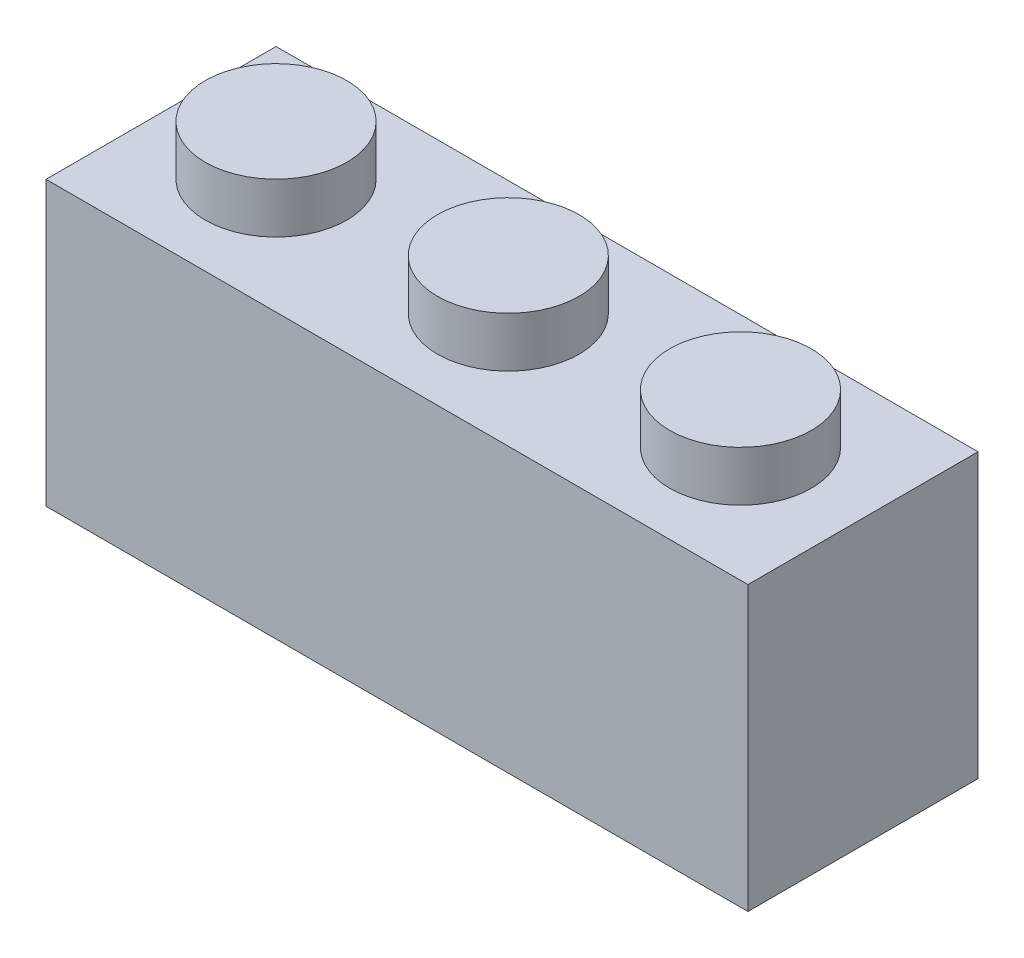
ISO-10303-21;
HEADER;
FILE_DESCRIPTION(('STEP AP214'),'2;1');
FILE_NAME('part.step','',(''),(''),'','','');
FILE_SCHEMA(('AUTOMOTIVE_DESIGN { 1 0 10303 214 1 1 1 1 }'));
ENDSEC;
DATA;
#1=APPLICATION_CONTEXT('core data for automotive mechanical design processes');
#2=APPLICATION_PROTOCOL_DEFINITION('international standard','automotive_design',2000,#1);
#3=PRODUCT_CONTEXT('',#1,'mechanical');
#4=PRODUCT('Part','Part','',(#3));
#5=PRODUCT_RELATED_PRODUCT_CATEGORY('part','',(#4));
#6=PRODUCT_DEFINITION_FORMATION('','',#4);
#7=PRODUCT_DEFINITION_CONTEXT('part definition',#1,'design');
#8=PRODUCT_DEFINITION('design','',#6,#7);
#9=PRODUCT_DEFINITION_SHAPE('','',#8);
#10=(LENGTH_UNIT() NAMED_UNIT(*) SI_UNIT(.MILLI.,.METRE.));
#11=(NAMED_UNIT(*) PLANE_ANGLE_UNIT() SI_UNIT($,.RADIAN.));
#12=(NAMED_UNIT(*) SI_UNIT($,.STERADIAN.) SOLID_ANGLE_UNIT());
#13=UNCERTAINTY_MEASURE_WITH_UNIT(LENGTH_MEASURE(1.E-05),#10,'distance_accuracy_value','');
#14=(GEOMETRIC_REPRESENTATION_CONTEXT(3) GLOBAL_UNCERTAINTY_ASSIGNED_CONTEXT((#13)) GLOBAL_UNIT_ASSIGNED_CONTEXT((#10,
#11,#12)) REPRESENTATION_CONTEXT('',''));
#15=CARTESIAN_POINT('',(0.,0.,0.));
#16=DIRECTION('',(0.,0.,1.));
#17=DIRECTION('',(1.,0.,0.));
#18=AXIS2_PLACEMENT_3D('',#15,#16,#17);
#19=CARTESIAN_POINT('',(-11.9,9.6,3.89999999999999));
#20=DIRECTION('',(1.,0.,0.));
#21=DIRECTION('',(0.,0.,-1.));
#22=AXIS2_PLACEMENT_3D('',#19,#20,#21);
#23=PLANE('',#22);
#24=DIRECTION('',(0.,0.,1.));
#25=VECTOR('',#24,1.);
#26=CARTESIAN_POINT('',(-11.9,0.,3.89999999999999));
#27=LINE('',#26,#25);
#28=CARTESIAN_POINT('',(-11.9,0.,-3.9));
#29=VERTEX_POINT('',#28);
#30=CARTESIAN_POINT('',(-11.9,0.,3.89999999999999));
#31=VERTEX_POINT('',#30);
#32=EDGE_CURVE('E96',#29,#31,#27,.T.);
#33=ORIENTED_EDGE('',*,*,#32,.T.);
#34=DIRECTION('',(0.,-1.,0.));
#35=VECTOR('',#34,1.);
#36=CARTESIAN_POINT('',(-11.9,9.6,3.89999999999999));
#37=LINE('',#36,#35);
#38=CARTESIAN_POINT('',(-11.9,9.6,3.89999999999999));
#39=VERTEX_POINT('',#38);
#40=EDGE_CURVE('E11',#39,#31,#37,.T.);
#41=ORIENTED_EDGE('',*,*,#40,.F.);
#42=DIRECTION('',(0.,0.,1.));
#43=VECTOR('',#42,1.);
#44=CARTESIAN_POINT('',(-11.9,9.6,3.89999999999999));
#45=LINE('',#44,#43);
#46=CARTESIAN_POINT('',(-11.9,9.6,-3.9));
#47=VERTEX_POINT('',#46);
#48=EDGE_CURVE('E84',#47,#39,#45,.T.);
#49=ORIENTED_EDGE('',*,*,#48,.F.);
#50=DIRECTION('',(0.,-1.,0.));
#51=VECTOR('',#50,1.);
#52=CARTESIAN_POINT('',(-11.9,9.6,-3.9));
#53=LINE('',#52,#51);
#54=EDGE_CURVE('E92',#47,#29,#53,.T.);
#55=ORIENTED_EDGE('',*,*,#54,.T.);
#56=EDGE_LOOP('',(#33,#41,#49,#55));
#57=FACE_BOUND('',#56,.T.);
#58=ADVANCED_FACE('F33',(#57),#23,.F.);
#59=CARTESIAN_POINT('',(11.9,9.6,3.9));
#60=DIRECTION('',(0.,0.,-1.));
#61=DIRECTION('',(-1.,0.,0.));
#62=AXIS2_PLACEMENT_3D('',#59,#60,#61);
#63=PLANE('',#62);
#64=DIRECTION('',(1.,0.,0.));
#65=VECTOR('',#64,1.);
#66=CARTESIAN_POINT('',(11.9,0.,3.9));
#67=LINE('',#66,#65);
#68=CARTESIAN_POINT('',(11.9,0.,3.9));
#69=VERTEX_POINT('',#68);
#70=EDGE_CURVE('E88',#31,#69,#67,.T.);
#71=ORIENTED_EDGE('',*,*,#70,.T.);
#72=DIRECTION('',(0.,-1.,0.));
#73=VECTOR('',#72,1.);
#74=CARTESIAN_POINT('',(11.9,9.6,3.9));
#75=LINE('',#74,#73);
#76=CARTESIAN_POINT('',(11.9,9.6,3.9));
#77=VERTEX_POINT('',#76);
#78=EDGE_CURVE('E41',#77,#69,#75,.T.);
#79=ORIENTED_EDGE('',*,*,#78,.F.);
#80=DIRECTION('',(1.,0.,0.));
#81=VECTOR('',#80,1.);
#82=CARTESIAN_POINT('',(11.9,9.6,3.9));
#83=LINE('',#82,#81);
#84=EDGE_CURVE('E79',#39,#77,#83,.T.);
#85=ORIENTED_EDGE('',*,*,#84,.F.);
#86=ORIENTED_EDGE('',*,*,#40,.T.);
#87=EDGE_LOOP('',(#71,#79,#85,#86));
#88=FACE_BOUND('',#87,.T.);
#89=ADVANCED_FACE('F87',(#88),#63,.F.);
#90=CARTESIAN_POINT('',(11.9,9.6,3.9));
#91=DIRECTION('',(-1.,0.,0.));
#92=DIRECTION('',(0.,0.,1.));
#93=AXIS2_PLACEMENT_3D('',#90,#91,#92);
#94=PLANE('',#93);
#95=DIRECTION('',(0.,0.,-1.));
#96=VECTOR('',#95,1.);
#97=CARTESIAN_POINT('',(11.9,0.,3.9));
#98=LINE('',#97,#96);
#99=CARTESIAN_POINT('',(11.9,0.,-3.9));
#100=VERTEX_POINT('',#99);
#101=EDGE_CURVE('E66',#69,#100,#98,.T.);
#102=ORIENTED_EDGE('',*,*,#101,.T.);
#103=DIRECTION('',(0.,-1.,0.));
#104=VECTOR('',#103,1.);
#105=CARTESIAN_POINT('',(11.9,9.6,-3.9));
#106=LINE('',#105,#104);
#107=CARTESIAN_POINT('',(11.9,9.6,-3.9));
#108=VERTEX_POINT('',#107);
#109=EDGE_CURVE('E89',#108,#100,#106,.T.);
#110=ORIENTED_EDGE('',*,*,#109,.F.);
#111=DIRECTION('',(0.,0.,-1.));
#112=VECTOR('',#111,1.);
#113=CARTESIAN_POINT('',(11.9,9.6,3.9));
#114=LINE('',#113,#112);
#115=EDGE_CURVE('E82',#77,#108,#114,.T.);
#116=ORIENTED_EDGE('',*,*,#115,.F.);
#117=ORIENTED_EDGE('',*,*,#78,.T.);
#118=EDGE_LOOP('',(#102,#110,#116,#117));
#119=FACE_BOUND('',#118,.T.);
#120=ADVANCED_FACE('F90',(#119),#94,.F.);
#121=CARTESIAN_POINT('',(11.9,9.6,-3.9));
#122=DIRECTION('',(0.,0.,1.));
#123=DIRECTION('',(1.,0.,0.));
#124=AXIS2_PLACEMENT_3D('',#121,#122,#123);
#125=PLANE('',#124);
#126=DIRECTION('',(-1.,0.,0.));
#127=VECTOR('',#126,1.);
#128=CARTESIAN_POINT('',(11.9,0.,-3.9));
#129=LINE('',#128,#127);
#130=EDGE_CURVE('E72',#100,#29,#129,.T.);
#131=ORIENTED_EDGE('',*,*,#130,.T.);
#132=ORIENTED_EDGE('',*,*,#54,.F.);
#133=DIRECTION('',(-1.,0.,0.));
#134=VECTOR('',#133,1.);
#135=CARTESIAN_POINT('',(11.9,9.6,-3.9));
#136=LINE('',#135,#134);
#137=EDGE_CURVE('E49',#108,#47,#136,.T.);
#138=ORIENTED_EDGE('',*,*,#137,.F.);
#139=ORIENTED_EDGE('',*,*,#109,.T.);
#140=EDGE_LOOP('',(#131,#132,#138,#139));
#141=FACE_BOUND('',#140,.T.);
#142=ADVANCED_FACE('F104',(#141),#125,.F.);
#143=CARTESIAN_POINT('',(0.,9.6,0.));
#144=DIRECTION('',(0.,1.,0.));
#145=DIRECTION('',(0.,0.,1.));
#146=AXIS2_PLACEMENT_3D('',#143,#144,#145);
#147=PLANE('',#146);
#148=CARTESIAN_POINT('',(7.74800000000003,9.6,0.));
#149=DIRECTION('',(0.,1.,0.));
#150=DIRECTION('',(0.,0.,1.));
#151=AXIS2_PLACEMENT_3D('',#148,#149,#150);
#152=CIRCLE('',#151,2.4);
#153=CARTESIAN_POINT('',(7.74800000000003,9.6,2.4));
#154=VERTEX_POINT('',#153);
#155=EDGE_CURVE('E122',#154,#154,#152,.T.);
#156=ORIENTED_EDGE('',*,*,#155,.F.);
#157=EDGE_LOOP('',(#156));
#158=FACE_BOUND('',#157,.T.);
#159=CARTESIAN_POINT('',(-0.125999999999973,9.6,0.));
#160=DIRECTION('',(0.,1.,0.));
#161=DIRECTION('',(0.,0.,1.));
#162=AXIS2_PLACEMENT_3D('',#159,#160,#161);
#163=CIRCLE('',#162,2.4);
#164=CARTESIAN_POINT('',(-0.125999999999973,9.6,2.4));
#165=VERTEX_POINT('',#164);
#166=EDGE_CURVE('E116',#165,#165,#163,.T.);
#167=ORIENTED_EDGE('',*,*,#166,.F.);
#168=EDGE_LOOP('',(#167));
#169=FACE_BOUND('',#168,.T.);
#170=CARTESIAN_POINT('',(-7.99999999999997,9.6,0.));
#171=DIRECTION('',(0.,1.,0.));
#172=DIRECTION('',(0.,0.,1.));
#173=AXIS2_PLACEMENT_3D('',#170,#171,#172);
#174=CIRCLE('',#173,2.4);
#175=CARTESIAN_POINT('',(-7.99999999999997,9.6,2.4));
#176=VERTEX_POINT('',#175);
#177=EDGE_CURVE('E110',#176,#176,#174,.T.);
#178=ORIENTED_EDGE('',*,*,#177,.F.);
#179=EDGE_LOOP('',(#178));
#180=FACE_BOUND('',#179,.T.);
#181=ORIENTED_EDGE('',*,*,#48,.T.);
#182=ORIENTED_EDGE('',*,*,#84,.T.);
#183=ORIENTED_EDGE('',*,*,#115,.T.);
#184=ORIENTED_EDGE('',*,*,#137,.T.);
#185=EDGE_LOOP('',(#181,#182,#183,#184));
#186=FACE_BOUND('',#185,.T.);
#187=ADVANCED_FACE('F80',(#158,#169,#180,#186),#147,.T.);
#188=CARTESIAN_POINT('',(0.,0.,0.));
#189=DIRECTION('',(0.,1.,0.));
#190=DIRECTION('',(0.,0.,1.));
#191=AXIS2_PLACEMENT_3D('',#188,#189,#190);
#192=PLANE('',#191);
#193=CARTESIAN_POINT('',(-7.99999999999997,0.,0.));
#194=DIRECTION('',(0.,-1.,0.));
#195=DIRECTION('',(0.,0.,-1.));
#196=AXIS2_PLACEMENT_3D('',#193,#194,#195);
#197=CIRCLE('',#196,2.5);
#198=CARTESIAN_POINT('',(-7.99999999999997,0.,-2.5));
#199=VERTEX_POINT('',#198);
#200=EDGE_CURVE('E140',#199,#199,#197,.T.);
#201=ORIENTED_EDGE('',*,*,#200,.F.);
#202=EDGE_LOOP('',(#201));
#203=FACE_BOUND('',#202,.T.);
#204=CARTESIAN_POINT('',(-0.125999999999975,0.,0.));
#205=DIRECTION('',(0.,-1.,0.));
#206=DIRECTION('',(0.,0.,-1.));
#207=AXIS2_PLACEMENT_3D('',#204,#205,#206);
#208=CIRCLE('',#207,2.5);
#209=CARTESIAN_POINT('',(-0.125999999999975,0.,-2.5));
#210=VERTEX_POINT('',#209);
#211=EDGE_CURVE('E134',#210,#210,#208,.T.);
#212=ORIENTED_EDGE('',*,*,#211,.F.);
#213=EDGE_LOOP('',(#212));
#214=FACE_BOUND('',#213,.T.);
#215=CARTESIAN_POINT('',(7.74800000000002,0.,0.));
#216=DIRECTION('',(0.,-1.,0.));
#217=DIRECTION('',(0.,0.,-1.));
#218=AXIS2_PLACEMENT_3D('',#215,#216,#217);
#219=CIRCLE('',#218,2.5);
#220=CARTESIAN_POINT('',(7.74800000000002,0.,-2.5));
#221=VERTEX_POINT('',#220);
#222=EDGE_CURVE('E128',#221,#221,#219,.T.);
#223=ORIENTED_EDGE('',*,*,#222,.F.);
#224=EDGE_LOOP('',(#223));
#225=FACE_BOUND('',#224,.T.);
#226=ORIENTED_EDGE('',*,*,#32,.F.);
#227=ORIENTED_EDGE('',*,*,#130,.F.);
#228=ORIENTED_EDGE('',*,*,#101,.F.);
#229=ORIENTED_EDGE('',*,*,#70,.F.);
#230=EDGE_LOOP('',(#226,#227,#228,#229));
#231=FACE_BOUND('',#230,.T.);
#232=ADVANCED_FACE('F107',(#203,#214,#225,#231),#192,.F.);
#233=CARTESIAN_POINT('',(-7.99999999999997,11.3,0.));
#234=DIRECTION('',(0.,-1.,0.));
#235=DIRECTION('',(0.,0.,-1.));
#236=AXIS2_PLACEMENT_3D('',#233,#234,#235);
#237=CYLINDRICAL_SURFACE('',#236,2.4);
#238=CARTESIAN_POINT('',(-7.99999999999997,11.3,0.));
#239=DIRECTION('',(0.,1.,0.));
#240=DIRECTION('',(0.,0.,1.));
#241=AXIS2_PLACEMENT_3D('',#238,#239,#240);
#242=CIRCLE('',#241,2.4);
#243=CARTESIAN_POINT('',(-7.99999999999997,11.3,2.4));
#244=VERTEX_POINT('',#243);
#245=EDGE_CURVE('E99',#244,#244,#242,.T.);
#246=ORIENTED_EDGE('',*,*,#245,.F.);
#247=EDGE_LOOP('',(#246));
#248=FACE_BOUND('',#247,.T.);
#249=ORIENTED_EDGE('',*,*,#177,.T.);
#250=EDGE_LOOP('',(#249));
#251=FACE_BOUND('',#250,.T.);
#252=ADVANCED_FACE('F157',(#248,#251),#237,.T.);
#253=CARTESIAN_POINT('',(-7.99999999999997,11.3,0.));
#254=DIRECTION('',(0.,1.,0.));
#255=DIRECTION('',(0.,0.,1.));
#256=AXIS2_PLACEMENT_3D('',#253,#254,#255);
#257=PLANE('',#256);
#258=ORIENTED_EDGE('',*,*,#245,.T.);
#259=EDGE_LOOP('',(#258));
#260=FACE_BOUND('',#259,.T.);
#261=ADVANCED_FACE('F196',(#260),#257,.T.);
#262=CARTESIAN_POINT('',(-0.125999999999973,11.3,0.));
#263=DIRECTION('',(0.,-1.,0.));
#264=DIRECTION('',(0.,0.,-1.));
#265=AXIS2_PLACEMENT_3D('',#262,#263,#264);
#266=CYLINDRICAL_SURFACE('',#265,2.4);
#267=CARTESIAN_POINT('',(-0.125999999999973,11.3,0.));
#268=DIRECTION('',(0.,1.,0.));
#269=DIRECTION('',(0.,0.,1.));
#270=AXIS2_PLACEMENT_3D('',#267,#268,#269);
#271=CIRCLE('',#270,2.4);
#272=CARTESIAN_POINT('',(-0.125999999999973,11.3,2.4));
#273=VERTEX_POINT('',#272);
#274=EDGE_CURVE('E113',#273,#273,#271,.T.);
#275=ORIENTED_EDGE('',*,*,#274,.F.);
#276=EDGE_LOOP('',(#275));
#277=FACE_BOUND('',#276,.T.);
#278=ORIENTED_EDGE('',*,*,#166,.T.);
#279=EDGE_LOOP('',(#278));
#280=FACE_BOUND('',#279,.T.);
#281=ADVANCED_FACE('F200',(#277,#280),#266,.T.);
#282=CARTESIAN_POINT('',(-0.125999999999973,11.3,0.));
#283=DIRECTION('',(0.,1.,0.));
#284=DIRECTION('',(0.,0.,1.));
#285=AXIS2_PLACEMENT_3D('',#282,#283,#284);
#286=PLANE('',#285);
#287=ORIENTED_EDGE('',*,*,#274,.T.);
#288=EDGE_LOOP('',(#287));
#289=FACE_BOUND('',#288,.T.);
#290=ADVANCED_FACE('F204',(#289),#286,.T.);
#291=CARTESIAN_POINT('',(7.74800000000003,11.3,0.));
#292=DIRECTION('',(0.,-1.,0.));
#293=DIRECTION('',(0.,0.,-1.));
#294=AXIS2_PLACEMENT_3D('',#291,#292,#293);
#295=CYLINDRICAL_SURFACE('',#294,2.4);
#296=CARTESIAN_POINT('',(7.74800000000003,11.3,0.));
#297=DIRECTION('',(0.,1.,0.));
#298=DIRECTION('',(0.,0.,1.));
#299=AXIS2_PLACEMENT_3D('',#296,#297,#298);
#300=CIRCLE('',#299,2.4);
#301=CARTESIAN_POINT('',(7.74800000000003,11.3,2.4));
#302=VERTEX_POINT('',#301);
#303=EDGE_CURVE('E119',#302,#302,#300,.T.);
#304=ORIENTED_EDGE('',*,*,#303,.F.);
#305=EDGE_LOOP('',(#304));
#306=FACE_BOUND('',#305,.T.);
#307=ORIENTED_EDGE('',*,*,#155,.T.);
#308=EDGE_LOOP('',(#307));
#309=FACE_BOUND('',#308,.T.);
#310=ADVANCED_FACE('F176',(#306,#309),#295,.T.);
#311=CARTESIAN_POINT('',(7.74800000000003,11.3,0.));
#312=DIRECTION('',(0.,1.,0.));
#313=DIRECTION('',(0.,0.,1.));
#314=AXIS2_PLACEMENT_3D('',#311,#312,#313);
#315=PLANE('',#314);
#316=ORIENTED_EDGE('',*,*,#303,.T.);
#317=EDGE_LOOP('',(#316));
#318=FACE_BOUND('',#317,.T.);
#319=ADVANCED_FACE('F166',(#318),#315,.T.);
#320=CARTESIAN_POINT('',(7.74800000000002,1.8,0.));
#321=DIRECTION('',(0.,-1.,0.));
#322=DIRECTION('',(0.,0.,-1.));
#323=AXIS2_PLACEMENT_3D('',#320,#321,#322);
#324=CYLINDRICAL_SURFACE('',#323,2.5);
#325=CARTESIAN_POINT('',(7.74800000000002,1.8,0.));
#326=DIRECTION('',(0.,-1.,0.));
#327=DIRECTION('',(0.,0.,-1.));
#328=AXIS2_PLACEMENT_3D('',#325,#326,#327);
#329=CIRCLE('',#328,2.5);
#330=CARTESIAN_POINT('',(7.74800000000002,1.8,-2.5));
#331=VERTEX_POINT('',#330);
#332=EDGE_CURVE('E131',#331,#331,#329,.T.);
#333=ORIENTED_EDGE('',*,*,#332,.F.);
#334=EDGE_LOOP('',(#333));
#335=FACE_BOUND('',#334,.T.);
#336=ORIENTED_EDGE('',*,*,#222,.T.);
#337=EDGE_LOOP('',(#336));
#338=FACE_BOUND('',#337,.T.);
#339=ADVANCED_FACE('F163',(#335,#338),#324,.F.);
#340=CARTESIAN_POINT('',(7.74800000000002,1.8,0.));
#341=DIRECTION('',(0.,-1.,0.));
#342=DIRECTION('',(0.,0.,-1.));
#343=AXIS2_PLACEMENT_3D('',#340,#341,#342);
#344=PLANE('',#343);
#345=ORIENTED_EDGE('',*,*,#332,.T.);
#346=EDGE_LOOP('',(#345));
#347=FACE_BOUND('',#346,.T.);
#348=ADVANCED_FACE('F165',(#347),#344,.T.);
#349=CARTESIAN_POINT('',(-0.125999999999975,1.8,0.));
#350=DIRECTION('',(0.,-1.,0.));
#351=DIRECTION('',(0.,0.,-1.));
#352=AXIS2_PLACEMENT_3D('',#349,#350,#351);
#353=CYLINDRICAL_SURFACE('',#352,2.5);
#354=CARTESIAN_POINT('',(-0.125999999999975,1.8,0.));
#355=DIRECTION('',(0.,-1.,0.));
#356=DIRECTION('',(0.,0.,-1.));
#357=AXIS2_PLACEMENT_3D('',#354,#355,#356);
#358=CIRCLE('',#357,2.5);
#359=CARTESIAN_POINT('',(-0.125999999999975,1.8,-2.5));
#360=VERTEX_POINT('',#359);
#361=EDGE_CURVE('E137',#360,#360,#358,.T.);
#362=ORIENTED_EDGE('',*,*,#361,.F.);
#363=EDGE_LOOP('',(#362));
#364=FACE_BOUND('',#363,.T.);
#365=ORIENTED_EDGE('',*,*,#211,.T.);
#366=EDGE_LOOP('',(#365));
#367=FACE_BOUND('',#366,.T.);
#368=ADVANCED_FACE('F173',(#364,#367),#353,.F.);
#369=CARTESIAN_POINT('',(-0.125999999999975,1.8,0.));
#370=DIRECTION('',(0.,-1.,0.));
#371=DIRECTION('',(0.,0.,-1.));
#372=AXIS2_PLACEMENT_3D('',#369,#370,#371);
#373=PLANE('',#372);
#374=ORIENTED_EDGE('',*,*,#361,.T.);
#375=EDGE_LOOP('',(#374));
#376=FACE_BOUND('',#375,.T.);
#377=ADVANCED_FACE('F151',(#376),#373,.T.);
#378=CARTESIAN_POINT('',(-7.99999999999997,1.8,0.));
#379=DIRECTION('',(0.,-1.,0.));
#380=DIRECTION('',(0.,0.,-1.));
#381=AXIS2_PLACEMENT_3D('',#378,#379,#380);
#382=CYLINDRICAL_SURFACE('',#381,2.5);
#383=CARTESIAN_POINT('',(-7.99999999999997,1.8,0.));
#384=DIRECTION('',(0.,-1.,0.));
#385=DIRECTION('',(0.,0.,-1.));
#386=AXIS2_PLACEMENT_3D('',#383,#384,#385);
#387=CIRCLE('',#386,2.5);
#388=CARTESIAN_POINT('',(-7.99999999999997,1.8,-2.5));
#389=VERTEX_POINT('',#388);
#390=EDGE_CURVE('E125',#389,#389,#387,.T.);
#391=ORIENTED_EDGE('',*,*,#390,.F.);
#392=EDGE_LOOP('',(#391));
#393=FACE_BOUND('',#392,.T.);
#394=ORIENTED_EDGE('',*,*,#200,.T.);
#395=EDGE_LOOP('',(#394));
#396=FACE_BOUND('',#395,.T.);
#397=ADVANCED_FACE('F148',(#393,#396),#382,.F.);
#398=CARTESIAN_POINT('',(-7.99999999999997,1.8,0.));
#399=DIRECTION('',(0.,-1.,0.));
#400=DIRECTION('',(0.,0.,-1.));
#401=AXIS2_PLACEMENT_3D('',#398,#399,#400);
#402=PLANE('',#401);
#403=ORIENTED_EDGE('',*,*,#390,.T.);
#404=EDGE_LOOP('',(#403));
#405=FACE_BOUND('',#404,.T.);
#406=ADVANCED_FACE('F146',(#405),#402,.T.);
#407=CLOSED_SHELL('',(#58,#89,#120,#142,#187,#232,#252,#261,#281,#290,#310,#319,#339,#348,#368,
#377,#397,#406));
#408=MANIFOLD_SOLID_BREP('B2',#407);
#409=ADVANCED_BREP_SHAPE_REPRESENTATION('',(#18,#408),#14);
#410=SHAPE_DEFINITION_REPRESENTATION(#9,#409);
ENDSEC;
END-ISO-10303-21;
